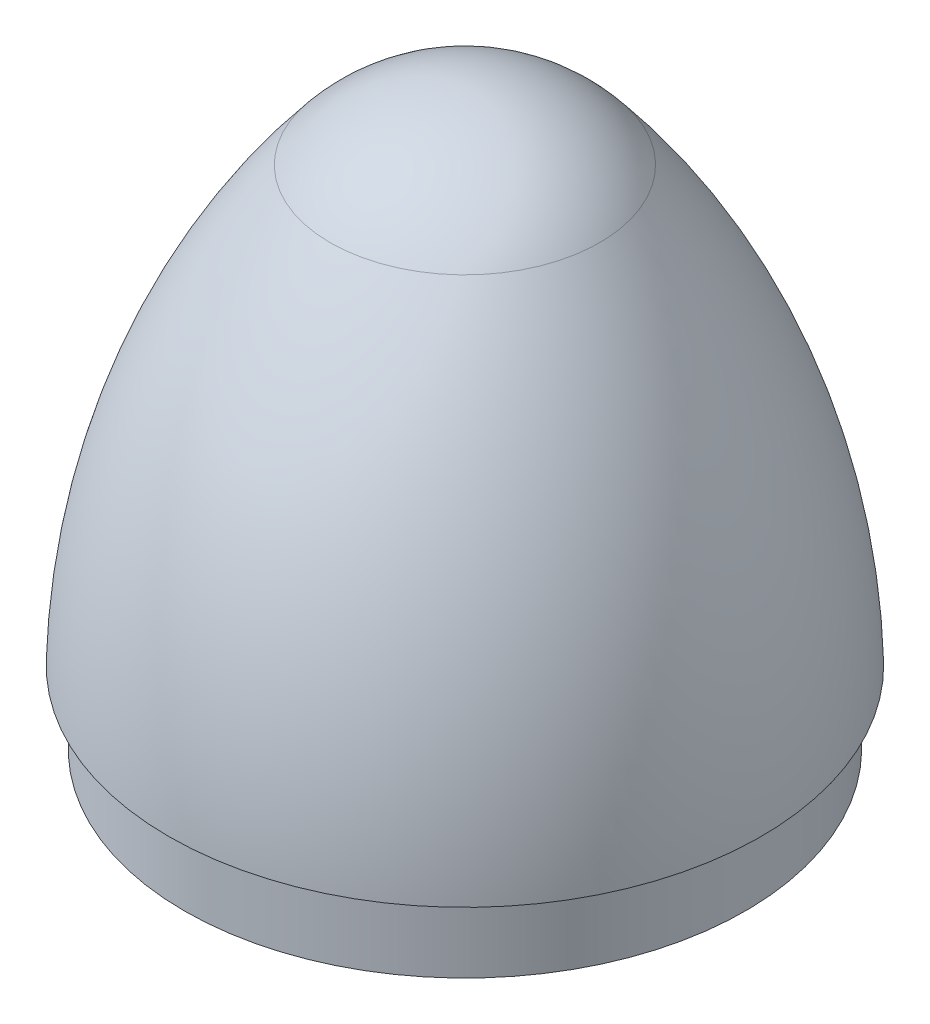
ISO-10303-21;
HEADER;
FILE_DESCRIPTION(('STEP AP214'),'2;1');
FILE_NAME('part.step','',(''),(''),'','','');
FILE_SCHEMA(('AUTOMOTIVE_DESIGN { 1 0 10303 214 1 1 1 1 }'));
ENDSEC;
DATA;
#1=APPLICATION_CONTEXT('core data for automotive mechanical design processes');
#2=APPLICATION_PROTOCOL_DEFINITION('international standard','automotive_design',2000,#1);
#3=PRODUCT_CONTEXT('',#1,'mechanical');
#4=PRODUCT('Part','Part','',(#3));
#5=PRODUCT_RELATED_PRODUCT_CATEGORY('part','',(#4));
#6=PRODUCT_DEFINITION_FORMATION('','',#4);
#7=PRODUCT_DEFINITION_CONTEXT('part definition',#1,'design');
#8=PRODUCT_DEFINITION('design','',#6,#7);
#9=PRODUCT_DEFINITION_SHAPE('','',#8);
#10=(LENGTH_UNIT() NAMED_UNIT(*) SI_UNIT(.MILLI.,.METRE.));
#11=(NAMED_UNIT(*) PLANE_ANGLE_UNIT() SI_UNIT($,.RADIAN.));
#12=(NAMED_UNIT(*) SI_UNIT($,.STERADIAN.) SOLID_ANGLE_UNIT());
#13=UNCERTAINTY_MEASURE_WITH_UNIT(LENGTH_MEASURE(1.E-05),#10,'distance_accuracy_value','');
#14=(GEOMETRIC_REPRESENTATION_CONTEXT(3) GLOBAL_UNCERTAINTY_ASSIGNED_CONTEXT((#13)) GLOBAL_UNIT_ASSIGNED_CONTEXT((#10,
#11,#12)) REPRESENTATION_CONTEXT('',''));
#15=CARTESIAN_POINT('',(0.,0.,0.));
#16=DIRECTION('',(0.,0.,1.));
#17=DIRECTION('',(1.,0.,0.));
#18=AXIS2_PLACEMENT_3D('',#15,#16,#17);
#19=CARTESIAN_POINT('',(33.,0.,0.));
#20=DIRECTION('',(0.,1.,0.));
#21=DIRECTION('',(0.,0.,1.));
#22=AXIS2_PLACEMENT_3D('',#19,#20,#21);
#23=PLANE('',#22);
#24=CARTESIAN_POINT('',(0.,0.,0.));
#25=DIRECTION('',(0.,1.,0.));
#26=DIRECTION('',(0.,0.,1.));
#27=AXIS2_PLACEMENT_3D('',#24,#25,#26);
#28=CIRCLE('',#27,36.);
#29=CARTESIAN_POINT('',(0.,0.,36.));
#30=VERTEX_POINT('',#29);
#31=EDGE_CURVE('E11',#30,#30,#28,.T.);
#32=ORIENTED_EDGE('',*,*,#31,.F.);
#33=EDGE_LOOP('',(#32));
#34=FACE_BOUND('',#33,.T.);
#35=CARTESIAN_POINT('',(0.,0.,0.));
#36=DIRECTION('',(0.,1.,0.));
#37=DIRECTION('',(0.,0.,1.));
#38=AXIS2_PLACEMENT_3D('',#35,#36,#37);
#39=CIRCLE('',#38,33.);
#40=CARTESIAN_POINT('',(0.,0.,33.));
#41=VERTEX_POINT('',#40);
#42=EDGE_CURVE('E81',#41,#41,#39,.T.);
#43=ORIENTED_EDGE('',*,*,#42,.T.);
#44=EDGE_LOOP('',(#43));
#45=FACE_BOUND('',#44,.T.);
#46=ADVANCED_FACE('F35',(#34,#45),#23,.F.);
#47=CARTESIAN_POINT('',(0.,85.6938969402446,0.));
#48=DIRECTION('',(0.,1.,0.));
#49=DIRECTION('',(0.,0.,1.));
#50=AXIS2_PLACEMENT_3D('',#47,#48,#49);
#51=CYLINDRICAL_SURFACE('',#50,36.);
#52=CARTESIAN_POINT('',(0.,9.27352740073821,0.));
#53=DIRECTION('',(0.,1.,0.));
#54=DIRECTION('',(0.,0.,1.));
#55=AXIS2_PLACEMENT_3D('',#52,#53,#54);
#56=CIRCLE('',#55,36.);
#57=CARTESIAN_POINT('',(0.,9.27352740073821,36.));
#58=VERTEX_POINT('',#57);
#59=EDGE_CURVE('E42',#58,#58,#56,.T.);
#60=ORIENTED_EDGE('',*,*,#59,.F.);
#61=EDGE_LOOP('',(#60));
#62=FACE_BOUND('',#61,.T.);
#63=ORIENTED_EDGE('',*,*,#31,.T.);
#64=EDGE_LOOP('',(#63));
#65=FACE_BOUND('',#64,.T.);
#66=ADVANCED_FACE('F72',(#62,#65),#51,.T.);
#67=CARTESIAN_POINT('',(36.,9.27352740073821,0.));
#68=DIRECTION('',(0.,1.,0.));
#69=DIRECTION('',(0.,0.,1.));
#70=AXIS2_PLACEMENT_3D('',#67,#68,#69);
#71=PLANE('',#70);
#72=CARTESIAN_POINT('',(0.,9.27352740073821,0.));
#73=DIRECTION('',(0.,1.,0.));
#74=DIRECTION('',(0.,0.,1.));
#75=AXIS2_PLACEMENT_3D('',#72,#73,#74);
#76=CIRCLE('',#75,38.);
#77=CARTESIAN_POINT('',(0.,9.27352740073821,38.));
#78=VERTEX_POINT('',#77);
#79=EDGE_CURVE('E58',#78,#78,#76,.T.);
#80=ORIENTED_EDGE('',*,*,#79,.F.);
#81=EDGE_LOOP('',(#80));
#82=FACE_BOUND('',#81,.T.);
#83=ORIENTED_EDGE('',*,*,#59,.T.);
#84=EDGE_LOOP('',(#83));
#85=FACE_BOUND('',#84,.T.);
#86=ADVANCED_FACE('F70',(#82,#85),#71,.F.);
#87=CARTESIAN_POINT('',(0.,6.94433844988118,0.));
#88=DIRECTION('',(0.,1.,0.));
#89=DIRECTION('',(0.,0.,1.));
#90=AXIS2_PLACEMENT_3D('',#87,#88,#89);
#91=DEGENERATE_TOROIDAL_SURFACE('',#90,53.4401452656913,91.4698053314837,.F.);
#92=CARTESIAN_POINT('',(0.,64.9302399905203,0.));
#93=DIRECTION('',(0.,1.,0.));
#94=DIRECTION('',(0.,0.,1.));
#95=AXIS2_PLACEMENT_3D('',#92,#93,#94);
#96=CIRCLE('',#95,17.3013595946015);
#97=CARTESIAN_POINT('',(0.,64.9302399905203,17.3013595946015));
#98=VERTEX_POINT('',#97);
#99=EDGE_CURVE('E56',#98,#98,#96,.T.);
#100=ORIENTED_EDGE('',*,*,#99,.F.);
#101=EDGE_LOOP('',(#100));
#102=FACE_BOUND('',#101,.T.);
#103=ORIENTED_EDGE('',*,*,#79,.T.);
#104=EDGE_LOOP('',(#103));
#105=FACE_BOUND('',#104,.T.);
#106=ADVANCED_FACE('F52',(#102,#105),#91,.F.);
#107=CARTESIAN_POINT('',(0.,50.7850905084481,0.0445931350118133));
#108=DIRECTION('',(-1.,0.,0.));
#109=DIRECTION('',(0.,0.,1.));
#110=AXIS2_PLACEMENT_3D('',#107,#108,#109);
#111=CIRCLE('',#110,22.3132526206061);
#112=TRIMMED_CURVE('',#111,(PARAMETER_VALUE(-1.57279483259118)),
(PARAMETER_VALUE(1.57279483259118)),.T.,.PARAMETER.);
#113=CARTESIAN_POINT('',(0.,50.7850905084481,0.));
#114=DIRECTION('',(0.,1.,0.));
#115=AXIS1_PLACEMENT('',#113,#114);
#116=SURFACE_OF_REVOLUTION('',#112,#115);
#117=CARTESIAN_POINT('',(0.,73.09829856922,0.));
#118=VERTEX_POINT('',#117);
#119=VERTEX_LOOP('',#118);
#120=FACE_BOUND('',#119,.T.);
#121=ORIENTED_EDGE('',*,*,#99,.T.);
#122=EDGE_LOOP('',(#121));
#123=FACE_BOUND('',#122,.T.);
#124=ADVANCED_FACE('F48',(#120,#123),#116,.T.);
#125=CARTESIAN_POINT('',(0.,50.9377170269679,-0.0247660007061754));
#126=DIRECTION('',(-1.,0.,0.));
#127=DIRECTION('',(0.,0.,1.));
#128=AXIS2_PLACEMENT_3D('',#125,#126,#127);
#129=CIRCLE('',#128,19.5649241835926);
#130=TRIMMED_CURVE('',#129,(PARAMETER_VALUE(-1.56953048967293)),
(PARAMETER_VALUE(1.56953048967293)),.T.,.PARAMETER.);
#131=CARTESIAN_POINT('',(0.,50.9377170269679,0.));
#132=DIRECTION('',(0.,1.,0.));
#133=AXIS1_PLACEMENT('',#131,#132);
#134=SURFACE_OF_REVOLUTION('',#130,#133);
#135=CARTESIAN_POINT('',(0.,62.7708708487805,0.));
#136=DIRECTION('',(0.,1.,0.));
#137=DIRECTION('',(0.,0.,1.));
#138=AXIS2_PLACEMENT_3D('',#135,#136,#137);
#139=CIRCLE('',#138,15.5560789359154);
#140=CARTESIAN_POINT('',(0.,62.7708708487805,15.5560789359154));
#141=VERTEX_POINT('',#140);
#142=EDGE_CURVE('E59',#141,#141,#139,.T.);
#143=ORIENTED_EDGE('',*,*,#142,.F.);
#144=EDGE_LOOP('',(#143));
#145=FACE_BOUND('',#144,.T.);
#146=CARTESIAN_POINT('',(0.,70.5026255356969,0.));
#147=VERTEX_POINT('',#146);
#148=VERTEX_LOOP('',#147);
#149=FACE_BOUND('',#148,.T.);
#150=ADVANCED_FACE('F51',(#145,#149),#134,.F.);
#151=CARTESIAN_POINT('',(0.,4.06148609094862,0.));
#152=DIRECTION('',(0.,1.,0.));
#153=DIRECTION('',(0.,0.,1.));
#154=AXIS2_PLACEMENT_3D('',#151,#152,#153);
#155=DEGENERATE_TOROIDAL_SURFACE('',#154,61.7472194079333,97.0700355077777,.F.);
#156=CARTESIAN_POINT('',(0.,11.971437438109,0.));
#157=DIRECTION('',(0.,1.,0.));
#158=DIRECTION('',(0.,0.,1.));
#159=AXIS2_PLACEMENT_3D('',#156,#157,#158);
#160=CIRCLE('',#159,35.);
#161=CARTESIAN_POINT('',(0.,11.971437438109,35.));
#162=VERTEX_POINT('',#161);
#163=EDGE_CURVE('E64',#162,#162,#160,.T.);
#164=ORIENTED_EDGE('',*,*,#163,.F.);
#165=EDGE_LOOP('',(#164));
#166=FACE_BOUND('',#165,.T.);
#167=ORIENTED_EDGE('',*,*,#142,.T.);
#168=EDGE_LOOP('',(#167));
#169=FACE_BOUND('',#168,.T.);
#170=ADVANCED_FACE('F92',(#166,#169),#155,.T.);
#171=CARTESIAN_POINT('',(33.,11.971437438109,0.));
#172=DIRECTION('',(0.,-1.,0.));
#173=DIRECTION('',(0.,0.,-1.));
#174=AXIS2_PLACEMENT_3D('',#171,#172,#173);
#175=PLANE('',#174);
#176=CARTESIAN_POINT('',(0.,11.971437438109,0.));
#177=DIRECTION('',(0.,1.,0.));
#178=DIRECTION('',(0.,0.,1.));
#179=AXIS2_PLACEMENT_3D('',#176,#177,#178);
#180=CIRCLE('',#179,33.);
#181=CARTESIAN_POINT('',(0.,11.971437438109,33.));
#182=VERTEX_POINT('',#181);
#183=EDGE_CURVE('E83',#182,#182,#180,.T.);
#184=ORIENTED_EDGE('',*,*,#183,.F.);
#185=EDGE_LOOP('',(#184));
#186=FACE_BOUND('',#185,.T.);
#187=ORIENTED_EDGE('',*,*,#163,.T.);
#188=EDGE_LOOP('',(#187));
#189=FACE_BOUND('',#188,.T.);
#190=ADVANCED_FACE('F90',(#186,#189),#175,.F.);
#191=CARTESIAN_POINT('',(0.,85.6938969402446,0.));
#192=DIRECTION('',(0.,1.,0.));
#193=DIRECTION('',(0.,0.,1.));
#194=AXIS2_PLACEMENT_3D('',#191,#192,#193);
#195=CYLINDRICAL_SURFACE('',#194,33.);
#196=ORIENTED_EDGE('',*,*,#42,.F.);
#197=EDGE_LOOP('',(#196));
#198=FACE_BOUND('',#197,.T.);
#199=ORIENTED_EDGE('',*,*,#183,.T.);
#200=EDGE_LOOP('',(#199));
#201=FACE_BOUND('',#200,.T.);
#202=ADVANCED_FACE('F141',(#198,#201),#195,.F.);
#203=CLOSED_SHELL('',(#46,#66,#86,#106,#124,#150,#170,#190,#202));
#204=MANIFOLD_SOLID_BREP('B2',#203);
#205=ADVANCED_BREP_SHAPE_REPRESENTATION('',(#18,#204),#14);
#206=SHAPE_DEFINITION_REPRESENTATION(#9,#205);
ENDSEC;
END-ISO-10303-21;
